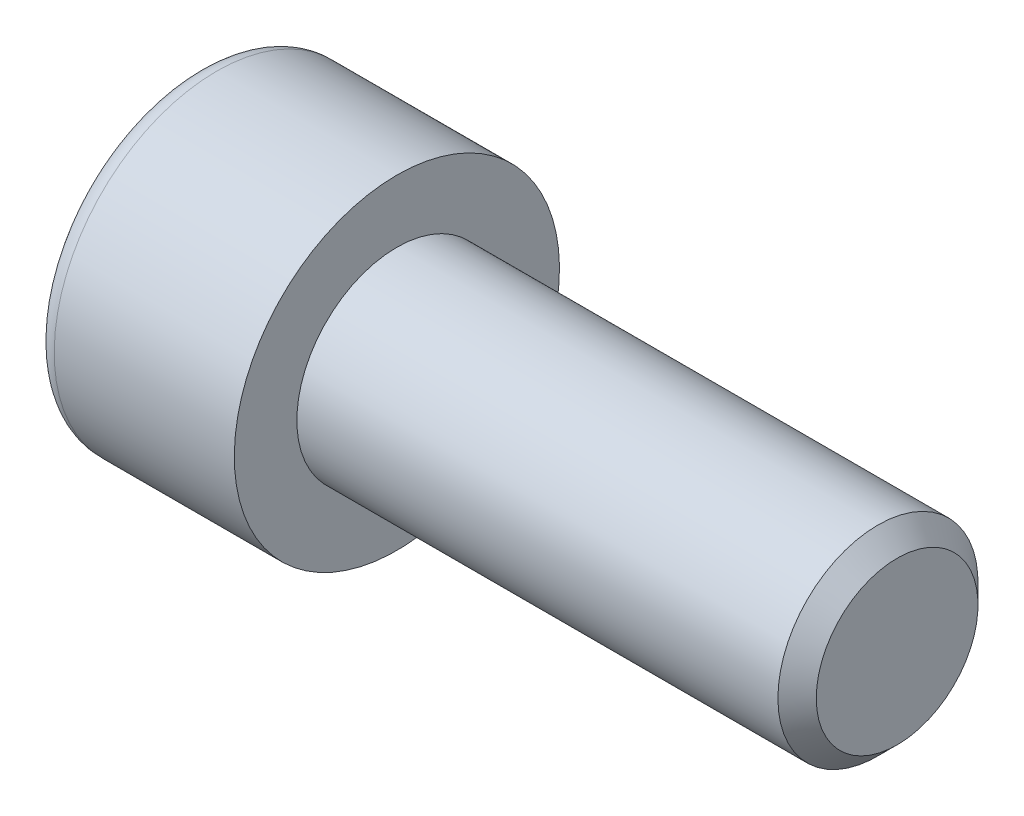
ISO-10303-21;
HEADER;
FILE_DESCRIPTION(('STEP AP214'),'2;1');
FILE_NAME('part.step','',(''),(''),'','','');
FILE_SCHEMA(('AUTOMOTIVE_DESIGN { 1 0 10303 214 1 1 1 1 }'));
ENDSEC;
DATA;
#1=APPLICATION_CONTEXT('core data for automotive mechanical design processes');
#2=APPLICATION_PROTOCOL_DEFINITION('international standard','automotive_design',2000,#1);
#3=PRODUCT_CONTEXT('',#1,'mechanical');
#4=PRODUCT('Part','Part','',(#3));
#5=PRODUCT_RELATED_PRODUCT_CATEGORY('part','',(#4));
#6=PRODUCT_DEFINITION_FORMATION('','',#4);
#7=PRODUCT_DEFINITION_CONTEXT('part definition',#1,'design');
#8=PRODUCT_DEFINITION('design','',#6,#7);
#9=PRODUCT_DEFINITION_SHAPE('','',#8);
#10=(LENGTH_UNIT() NAMED_UNIT(*) SI_UNIT(.MILLI.,.METRE.));
#11=(NAMED_UNIT(*) PLANE_ANGLE_UNIT() SI_UNIT($,.RADIAN.));
#12=(NAMED_UNIT(*) SI_UNIT($,.STERADIAN.) SOLID_ANGLE_UNIT());
#13=UNCERTAINTY_MEASURE_WITH_UNIT(LENGTH_MEASURE(1.E-05),#10,'distance_accuracy_value','');
#14=(GEOMETRIC_REPRESENTATION_CONTEXT(3) GLOBAL_UNCERTAINTY_ASSIGNED_CONTEXT((#13)) GLOBAL_UNIT_ASSIGNED_CONTEXT((#10,
#11,#12)) REPRESENTATION_CONTEXT('',''));
#15=CARTESIAN_POINT('',(0.,0.,0.));
#16=DIRECTION('',(0.,0.,1.));
#17=DIRECTION('',(1.,0.,0.));
#18=AXIS2_PLACEMENT_3D('',#15,#16,#17);
#19=CARTESIAN_POINT('',(-1.99999999995271,0.,0.));
#20=DIRECTION('',(-1.,0.,0.));
#21=DIRECTION('',(0.,0.,1.));
#22=AXIS2_PLACEMENT_3D('',#19,#20,#21);
#23=CONICAL_SURFACE('',#22,0.,1.04719755119726);
#24=CARTESIAN_POINT('',(-1.99999999995271,0.,0.));
#25=VERTEX_POINT('',#24);
#26=VERTEX_LOOP('',#25);
#27=FACE_BOUND('',#26,.T.);
#28=CARTESIAN_POINT('',(-3.99999999995355,1.16431272210433E-11,-3.46410161514448));
#29=CARTESIAN_POINT('',(-3.95604331764328,-0.1318318313331,-3.38798847182983));
#30=CARTESIAN_POINT('',(-3.91606701560335,-0.264801633170532,-3.3112183209449));
#31=CARTESIAN_POINT('',(-3.84628958105283,-0.533043520018228,-3.15634879536545));
#32=CARTESIAN_POINT('',(-3.81651313045926,-0.668320369616218,-3.07824666983492));
#33=CARTESIAN_POINT('',(-3.7701639383706,-0.937197650627964,-2.92301029926381));
#34=CARTESIAN_POINT('',(-3.75328268134649,-1.07075672341447,-2.84589993263781));
#35=CARTESIAN_POINT('',(-3.73313375214613,-1.33850298068321,-2.69131655892919));
#36=CARTESIAN_POINT('',(-3.72984939091142,-1.47268919264835,-2.61384411332958));
#37=CARTESIAN_POINT('',(-3.73669943518174,-1.72340173455697,-2.46909515976942));
#38=CARTESIAN_POINT('',(-3.74515192777386,-1.83996568595987,-2.40179693104915));
#39=CARTESIAN_POINT('',(-3.77193595102684,-2.0723342126447,-2.26763889961647));
#40=CARTESIAN_POINT('',(-3.79027662210282,-2.18813798482582,-2.20077956057452));
#41=CARTESIAN_POINT('',(-3.83612474995801,-2.4209852125897,-2.06634515094499));
#42=CARTESIAN_POINT('',(-3.86382646327845,-2.53799921308,-1.99878708626296));
#43=CARTESIAN_POINT('',(-3.92669764121117,-2.77028245501554,-1.86467829400323));
#44=CARTESIAN_POINT('',(-3.96185234308113,-2.88555466998203,-1.79812584966225));
#45=CARTESIAN_POINT('',(-3.99999999995355,-3.00000000001164,-1.73205080756215));
#46=B_SPLINE_CURVE_WITH_KNOTS('',3,(#28,#29,#30,#31,#32,#33,#34,#35,#36,#37,#38,#39,#40,#41,#42,
#43,#44,#45),.UNSPECIFIED.,.F.,.F.,(4,2,2,2,2,2,2,2,4),(0.,0.475524017336084,0.952190725542287,
1.41706140923175,1.88136133334984,2.28556167395698,2.69013629070679,3.10368243375452,
3.51641696030026),.UNSPECIFIED.);
#47=CARTESIAN_POINT('',(-3.99999999995355,0.,-3.46410161514448));
#48=VERTEX_POINT('',#47);
#49=CARTESIAN_POINT('',(-3.99999999995355,-3.00000000000582,-1.73205080757224));
#50=VERTEX_POINT('',#49);
#51=EDGE_CURVE('E112',#48,#50,#46,.T.);
#52=ORIENTED_EDGE('',*,*,#51,.T.);
#53=CARTESIAN_POINT('',(-3.99999999995355,-3.,-1.73205080758232));
#54=CARTESIAN_POINT('',(-3.95895066106131,-3.,-1.58986661086429));
#55=CARTESIAN_POINT('',(-3.92136883178841,-3.,-1.44655761128608));
#56=CARTESIAN_POINT('',(-3.85494761065179,-3.,-1.15761165691093));
#57=CARTESIAN_POINT('',(-3.82612777945757,-3.,-1.01197024655983));
#58=CARTESIAN_POINT('',(-3.77978200265961,-3.,-0.722321652527097));
#59=CARTESIAN_POINT('',(-3.76200896075295,-3.,-0.57835524906188));
#60=CARTESIAN_POINT('',(-3.73814970600197,-3.,-0.289591848223232));
#61=CARTESIAN_POINT('',(-3.73205080751895,-3.,-0.144795924111616));
#62=CARTESIAN_POINT('',(-3.73205080751895,-3.,0.144795924111616));
#63=CARTESIAN_POINT('',(-3.73814970600197,-3.,0.289591848223232));
#64=CARTESIAN_POINT('',(-3.76200896075295,-3.,0.57835524906188));
#65=CARTESIAN_POINT('',(-3.77978200265961,-3.,0.722321652527096));
#66=CARTESIAN_POINT('',(-3.82612777945757,-3.,1.01197024655983));
#67=CARTESIAN_POINT('',(-3.85494761065179,-3.,1.15761165691093));
#68=CARTESIAN_POINT('',(-3.92136883178841,-3.,1.44655761128608));
#69=CARTESIAN_POINT('',(-3.95895066106131,-3.,1.58986661086429));
#70=CARTESIAN_POINT('',(-3.99999999995355,-3.,1.73205080758232));
#71=B_SPLINE_CURVE_WITH_KNOTS('',3,(#53,#54,#55,#56,#57,#58,#59,#60,#61,#62,#63,#64,#65,#66,#67,
#68,#69,#70),.UNSPECIFIED.,.F.,.F.,(4,2,2,2,2,2,2,2,4),(0.,0.444110093832798,0.88920447903908,
1.32394628866482,1.7582154199005,2.19248455113618,2.62722636076192,3.07232074596821,
3.516430839801),.UNSPECIFIED.);
#72=CARTESIAN_POINT('',(-3.99999999995355,-3.00000000000582,1.73205080757224));
#73=VERTEX_POINT('',#72);
#74=EDGE_CURVE('E107',#50,#73,#71,.T.);
#75=ORIENTED_EDGE('',*,*,#74,.T.);
#76=CARTESIAN_POINT('',(-3.99999999995355,-3.00000000001164,1.73205080756216));
#77=CARTESIAN_POINT('',(-3.95604331764328,-2.8681681686669,1.8081639508768));
#78=CARTESIAN_POINT('',(-3.91606701560335,-2.73519836682947,1.88493410176174));
#79=CARTESIAN_POINT('',(-3.84628958105283,-2.46695647998177,2.03980362734119));
#80=CARTESIAN_POINT('',(-3.81651313045926,-2.33167963038378,2.11790575287171));
#81=CARTESIAN_POINT('',(-3.7701639383706,-2.06280234937204,2.27314212344282));
#82=CARTESIAN_POINT('',(-3.75328268134649,-1.92924327658553,2.35025249006882));
#83=CARTESIAN_POINT('',(-3.73313375214613,-1.6614970193168,2.50483586377744));
#84=CARTESIAN_POINT('',(-3.72984939091142,-1.52731080735165,2.58230830937705));
#85=CARTESIAN_POINT('',(-3.73669943518174,-1.27659826544303,2.72705726293721));
#86=CARTESIAN_POINT('',(-3.74515192777386,-1.16003431404013,2.79435549165748));
#87=CARTESIAN_POINT('',(-3.77193595102684,-0.927665787355303,2.92851352309016));
#88=CARTESIAN_POINT('',(-3.79027662210282,-0.811862015174179,2.99537286213211));
#89=CARTESIAN_POINT('',(-3.83612474995801,-0.5790147874103,3.12980727176164));
#90=CARTESIAN_POINT('',(-3.86382646327845,-0.462000786919997,3.19736533644368));
#91=CARTESIAN_POINT('',(-3.92669764121117,-0.22971754498446,3.3314741287034));
#92=CARTESIAN_POINT('',(-3.96185234308113,-0.114445330017974,3.39802657304438));
#93=CARTESIAN_POINT('',(-3.99999999995355,1.16435634268108E-11,3.46410161514448));
#94=B_SPLINE_CURVE_WITH_KNOTS('',3,(#76,#77,#78,#79,#80,#81,#82,#83,#84,#85,#86,#87,#88,#89,#90,
#91,#92,#93),.UNSPECIFIED.,.F.,.F.,(4,2,2,2,2,2,2,2,4),(0.,0.475524017336084,0.952190725542287,
1.41706140923175,1.88136133334984,2.28556167395698,2.69013629070679,3.10368243375452,
3.51641696030026),.UNSPECIFIED.);
#95=CARTESIAN_POINT('',(-3.99999999995355,0.,3.46410161514448));
#96=VERTEX_POINT('',#95);
#97=EDGE_CURVE('E90',#73,#96,#94,.T.);
#98=ORIENTED_EDGE('',*,*,#97,.T.);
#99=CARTESIAN_POINT('',(-3.99999999995355,-1.1643732701114E-11,3.46410161514448));
#100=CARTESIAN_POINT('',(-3.95604331764328,0.131831831333099,3.38798847182983));
#101=CARTESIAN_POINT('',(-3.91606701560335,0.264801633170531,3.3112183209449));
#102=CARTESIAN_POINT('',(-3.84628958105283,0.533043520018227,3.15634879536545));
#103=CARTESIAN_POINT('',(-3.81651313045926,0.668320369616217,3.07824666983492));
#104=CARTESIAN_POINT('',(-3.7701639383706,0.937197650627964,2.92301029926381));
#105=CARTESIAN_POINT('',(-3.75328268134649,1.07075672341447,2.84589993263781));
#106=CARTESIAN_POINT('',(-3.73313375214612,1.3385029806832,2.69131655892919));
#107=CARTESIAN_POINT('',(-3.72984939091142,1.47268919264835,2.61384411332958));
#108=CARTESIAN_POINT('',(-3.73669943518174,1.72340173455697,2.46909515976942));
#109=CARTESIAN_POINT('',(-3.74515192777386,1.83996568595987,2.40179693104915));
#110=CARTESIAN_POINT('',(-3.77193595102684,2.0723342126447,2.26763889961647));
#111=CARTESIAN_POINT('',(-3.79027662210282,2.18813798482582,2.20077956057452));
#112=CARTESIAN_POINT('',(-3.83612474995801,2.4209852125897,2.06634515094499));
#113=CARTESIAN_POINT('',(-3.86382646327845,2.53799921308,1.99878708626295));
#114=CARTESIAN_POINT('',(-3.92669764121117,2.77028245501554,1.86467829400323));
#115=CARTESIAN_POINT('',(-3.96185234308113,2.88555466998203,1.79812584966225));
#116=CARTESIAN_POINT('',(-3.99999999995355,3.00000000001165,1.73205080756215));
#117=B_SPLINE_CURVE_WITH_KNOTS('',3,(#99,#100,#101,#102,#103,#104,#105,#106,#107,#108,#109,#110,
#111,#112,#113,#114,#115,#116),.UNSPECIFIED.,.F.,.F.,(4,2,2,2,2,2,2,2,4),(0.,0.475524017336083,
0.952190725542287,1.41706140923175,1.88136133334984,2.28556167395698,2.69013629070679,
3.10368243375452,3.51641696030026),.UNSPECIFIED.);
#118=CARTESIAN_POINT('',(-3.99999999995355,3.00000000000582,1.73205080757224));
#119=VERTEX_POINT('',#118);
#120=EDGE_CURVE('E87',#96,#119,#117,.T.);
#121=ORIENTED_EDGE('',*,*,#120,.T.);
#122=CARTESIAN_POINT('',(-3.99999999995355,3.,1.73205080758232));
#123=CARTESIAN_POINT('',(-3.95895066106132,3.,1.58986661086428));
#124=CARTESIAN_POINT('',(-3.92136883178841,3.,1.44655761128608));
#125=CARTESIAN_POINT('',(-3.85494761065179,3.,1.15761165691093));
#126=CARTESIAN_POINT('',(-3.82612777945757,3.,1.01197024655983));
#127=CARTESIAN_POINT('',(-3.77978200265961,3.,0.722321652527095));
#128=CARTESIAN_POINT('',(-3.76200896075295,3.,0.578355249061879));
#129=CARTESIAN_POINT('',(-3.73814970600197,3.,0.289591848223232));
#130=CARTESIAN_POINT('',(-3.73205080751895,3.,0.144795924111616));
#131=CARTESIAN_POINT('',(-3.73205080751895,3.,-0.144795924111617));
#132=CARTESIAN_POINT('',(-3.73814970600197,3.,-0.289591848223233));
#133=CARTESIAN_POINT('',(-3.76200896075295,3.,-0.578355249061881));
#134=CARTESIAN_POINT('',(-3.77978200265961,3.,-0.722321652527099));
#135=CARTESIAN_POINT('',(-3.82612777945757,3.,-1.01197024655983));
#136=CARTESIAN_POINT('',(-3.85494761065179,3.,-1.15761165691094));
#137=CARTESIAN_POINT('',(-3.92136883178841,3.,-1.44655761128608));
#138=CARTESIAN_POINT('',(-3.95895066106132,3.,-1.58986661086429));
#139=CARTESIAN_POINT('',(-3.99999999995355,3.,-1.73205080758233));
#140=B_SPLINE_CURVE_WITH_KNOTS('',3,(#122,#123,#124,#125,#126,#127,#128,#129,#130,#131,#132,
#133,#134,#135,#136,#137,#138,#139),.UNSPECIFIED.,.F.,.F.,(4,2,2,2,2,2,2,2,4),(0.,
0.444110093832797,0.889204479039079,1.32394628866482,1.7582154199005,2.19248455113618,
2.62722636076192,3.07232074596821,3.51643083980101),.UNSPECIFIED.);
#141=CARTESIAN_POINT('',(-3.99999999995161,3.,-1.7320508075756));
#142=VERTEX_POINT('',#141);
#143=EDGE_CURVE('E21',#119,#142,#140,.T.);
#144=ORIENTED_EDGE('',*,*,#143,.T.);
#145=CARTESIAN_POINT('',(-3.99999999995355,3.00000000001164,-1.73205080756216));
#146=CARTESIAN_POINT('',(-3.95604331764328,2.8681681686669,-1.80816395087681));
#147=CARTESIAN_POINT('',(-3.91606701560335,2.73519836682947,-1.88493410176174));
#148=CARTESIAN_POINT('',(-3.84628958105283,2.46695647998177,-2.03980362734119));
#149=CARTESIAN_POINT('',(-3.81651313045926,2.33167963038378,-2.11790575287171));
#150=CARTESIAN_POINT('',(-3.7701639383706,2.06280234937203,-2.27314212344282));
#151=CARTESIAN_POINT('',(-3.75328268134649,1.92924327658553,-2.35025249006883));
#152=CARTESIAN_POINT('',(-3.73313375214613,1.66149701931679,-2.50483586377744));
#153=CARTESIAN_POINT('',(-3.72984939091142,1.52731080735165,-2.58230830937706));
#154=CARTESIAN_POINT('',(-3.73669943518174,1.27659826544302,-2.72705726293722));
#155=CARTESIAN_POINT('',(-3.74515192777386,1.16003431404013,-2.79435549165748));
#156=CARTESIAN_POINT('',(-3.77193595102684,0.927665787355302,-2.92851352309017));
#157=CARTESIAN_POINT('',(-3.79027662210282,0.811862015174178,-2.99537286213211));
#158=CARTESIAN_POINT('',(-3.83612474995801,0.5790147874103,-3.12980727176164));
#159=CARTESIAN_POINT('',(-3.86382646327845,0.462000786919997,-3.19736533644368));
#160=CARTESIAN_POINT('',(-3.92669764121117,0.229717544984461,-3.3314741287034));
#161=CARTESIAN_POINT('',(-3.96185234308113,0.114445330017975,-3.39802657304438));
#162=CARTESIAN_POINT('',(-3.99999999995355,-1.1642871473911E-11,-3.46410161514448));
#163=B_SPLINE_CURVE_WITH_KNOTS('',3,(#145,#146,#147,#148,#149,#150,#151,#152,#153,#154,#155,
#156,#157,#158,#159,#160,#161,#162),.UNSPECIFIED.,.F.,.F.,(4,2,2,2,2,2,2,2,4),(0.,
0.475524017336084,0.952190725542287,1.41706140923175,1.88136133334984,2.28556167395697,
2.69013629070679,3.10368243375452,3.51641696030025),.UNSPECIFIED.);
#164=EDGE_CURVE('E116',#142,#48,#163,.T.);
#165=ORIENTED_EDGE('',*,*,#164,.T.);
#166=EDGE_LOOP('',(#52,#75,#98,#121,#144,#165));
#167=FACE_BOUND('',#166,.T.);
#168=ADVANCED_FACE('F17',(#27,#167),#23,.F.);
#169=CARTESIAN_POINT('',(-8.,3.,1.73205080756887));
#170=DIRECTION('',(0.,1.,0.));
#171=DIRECTION('',(0.,0.,1.));
#172=AXIS2_PLACEMENT_3D('',#169,#170,#171);
#173=PLANE('',#172);
#174=DIRECTION('',(1.,0.,0.));
#175=VECTOR('',#174,1.);
#176=CARTESIAN_POINT('',(-8.,3.,1.73205080756887));
#177=LINE('',#176,#175);
#178=CARTESIAN_POINT('',(-8.,3.,1.73205080756887));
#179=VERTEX_POINT('',#178);
#180=EDGE_CURVE('E79',#119,#179,#177,.F.);
#181=ORIENTED_EDGE('',*,*,#180,.T.);
#182=DIRECTION('',(0.,0.,1.));
#183=VECTOR('',#182,1.);
#184=CARTESIAN_POINT('',(-8.,3.,0.));
#185=LINE('',#184,#183);
#186=CARTESIAN_POINT('',(-8.,3.,-1.73205080756888));
#187=VERTEX_POINT('',#186);
#188=EDGE_CURVE('E159',#187,#179,#185,.T.);
#189=ORIENTED_EDGE('',*,*,#188,.F.);
#190=DIRECTION('',(1.,0.,0.));
#191=VECTOR('',#190,1.);
#192=CARTESIAN_POINT('',(-8.,3.,-1.73205080756888));
#193=LINE('',#192,#191);
#194=EDGE_CURVE('E82',#187,#142,#193,.T.);
#195=ORIENTED_EDGE('',*,*,#194,.T.);
#196=ORIENTED_EDGE('',*,*,#143,.F.);
#197=EDGE_LOOP('',(#181,#189,#195,#196));
#198=FACE_BOUND('',#197,.T.);
#199=ADVANCED_FACE('F76',(#198),#173,.F.);
#200=CARTESIAN_POINT('',(-8.,0.,3.46410161513775));
#201=DIRECTION('',(0.,0.5,0.866025403784438));
#202=DIRECTION('',(0.,-0.866025403784438,0.5));
#203=AXIS2_PLACEMENT_3D('',#200,#201,#202);
#204=PLANE('',#203);
#205=DIRECTION('',(1.,0.,0.));
#206=VECTOR('',#205,1.);
#207=CARTESIAN_POINT('',(-8.,0.,3.46410161513775));
#208=LINE('',#207,#206);
#209=CARTESIAN_POINT('',(-8.,0.,3.46410161513775));
#210=VERTEX_POINT('',#209);
#211=EDGE_CURVE('E93',#96,#210,#208,.F.);
#212=ORIENTED_EDGE('',*,*,#211,.T.);
#213=DIRECTION('',(0.,-0.866025403784438,0.500000000000001));
#214=VECTOR('',#213,1.);
#215=CARTESIAN_POINT('',(-8.,3.,1.73205080756887));
#216=LINE('',#215,#214);
#217=EDGE_CURVE('E96',#179,#210,#216,.T.);
#218=ORIENTED_EDGE('',*,*,#217,.F.);
#219=ORIENTED_EDGE('',*,*,#180,.F.);
#220=ORIENTED_EDGE('',*,*,#120,.F.);
#221=EDGE_LOOP('',(#212,#218,#219,#220));
#222=FACE_BOUND('',#221,.T.);
#223=ADVANCED_FACE('F94',(#222),#204,.F.);
#224=CARTESIAN_POINT('',(-8.,-3.,1.73205080756888));
#225=DIRECTION('',(0.,-0.5,0.866025403784439));
#226=DIRECTION('',(0.,-0.866025403784439,-0.5));
#227=AXIS2_PLACEMENT_3D('',#224,#225,#226);
#228=PLANE('',#227);
#229=DIRECTION('',(1.,0.,0.));
#230=VECTOR('',#229,1.);
#231=CARTESIAN_POINT('',(-8.,-3.,1.73205080756888));
#232=LINE('',#231,#230);
#233=CARTESIAN_POINT('',(-8.,-3.,1.73205080756888));
#234=VERTEX_POINT('',#233);
#235=EDGE_CURVE('E105',#73,#234,#232,.F.);
#236=ORIENTED_EDGE('',*,*,#235,.T.);
#237=DIRECTION('',(0.,-0.866025403784439,-0.5));
#238=VECTOR('',#237,1.);
#239=CARTESIAN_POINT('',(-8.,0.,3.46410161513775));
#240=LINE('',#239,#238);
#241=EDGE_CURVE('E181',#210,#234,#240,.T.);
#242=ORIENTED_EDGE('',*,*,#241,.F.);
#243=ORIENTED_EDGE('',*,*,#211,.F.);
#244=ORIENTED_EDGE('',*,*,#97,.F.);
#245=EDGE_LOOP('',(#236,#242,#243,#244));
#246=FACE_BOUND('',#245,.T.);
#247=ADVANCED_FACE('F230',(#246),#228,.F.);
#248=CARTESIAN_POINT('',(-8.,-3.,-1.73205080756888));
#249=DIRECTION('',(0.,-1.,0.));
#250=DIRECTION('',(0.,0.,-1.));
#251=AXIS2_PLACEMENT_3D('',#248,#249,#250);
#252=PLANE('',#251);
#253=DIRECTION('',(1.,0.,0.));
#254=VECTOR('',#253,1.);
#255=CARTESIAN_POINT('',(-8.,-3.,-1.73205080756888));
#256=LINE('',#255,#254);
#257=CARTESIAN_POINT('',(-8.,-3.,-1.73205080756888));
#258=VERTEX_POINT('',#257);
#259=EDGE_CURVE('E110',#50,#258,#256,.F.);
#260=ORIENTED_EDGE('',*,*,#259,.T.);
#261=DIRECTION('',(0.,0.,1.));
#262=VECTOR('',#261,1.);
#263=CARTESIAN_POINT('',(-8.,-3.,0.));
#264=LINE('',#263,#262);
#265=EDGE_CURVE('E176',#234,#258,#264,.F.);
#266=ORIENTED_EDGE('',*,*,#265,.F.);
#267=ORIENTED_EDGE('',*,*,#235,.F.);
#268=ORIENTED_EDGE('',*,*,#74,.F.);
#269=EDGE_LOOP('',(#260,#266,#267,#268));
#270=FACE_BOUND('',#269,.T.);
#271=ADVANCED_FACE('F233',(#270),#252,.F.);
#272=CARTESIAN_POINT('',(-8.,0.,-3.46410161513776));
#273=DIRECTION('',(0.,-0.5,-0.866025403784438));
#274=DIRECTION('',(0.,0.866025403784438,-0.5));
#275=AXIS2_PLACEMENT_3D('',#272,#273,#274);
#276=PLANE('',#275);
#277=DIRECTION('',(1.,0.,0.));
#278=VECTOR('',#277,1.);
#279=CARTESIAN_POINT('',(-8.,0.,-3.46410161513775));
#280=LINE('',#279,#278);
#281=CARTESIAN_POINT('',(-8.,0.,-3.46410161513776));
#282=VERTEX_POINT('',#281);
#283=EDGE_CURVE('E41',#48,#282,#280,.F.);
#284=ORIENTED_EDGE('',*,*,#283,.T.);
#285=DIRECTION('',(0.,0.866025403784438,-0.5));
#286=VECTOR('',#285,1.);
#287=CARTESIAN_POINT('',(-8.,-3.,-1.73205080756888));
#288=LINE('',#287,#286);
#289=EDGE_CURVE('E171',#258,#282,#288,.T.);
#290=ORIENTED_EDGE('',*,*,#289,.F.);
#291=ORIENTED_EDGE('',*,*,#259,.F.);
#292=ORIENTED_EDGE('',*,*,#51,.F.);
#293=EDGE_LOOP('',(#284,#290,#291,#292));
#294=FACE_BOUND('',#293,.T.);
#295=ADVANCED_FACE('F237',(#294),#276,.F.);
#296=CARTESIAN_POINT('',(-8.,3.,-1.73205080756888));
#297=DIRECTION('',(0.,0.5,-0.866025403784439));
#298=DIRECTION('',(0.,0.866025403784439,0.5));
#299=AXIS2_PLACEMENT_3D('',#296,#297,#298);
#300=PLANE('',#299);
#301=ORIENTED_EDGE('',*,*,#194,.F.);
#302=DIRECTION('',(0.,0.866025403784439,0.5));
#303=VECTOR('',#302,1.);
#304=CARTESIAN_POINT('',(-8.,0.,-3.46410161513776));
#305=LINE('',#304,#303);
#306=EDGE_CURVE('E168',#282,#187,#305,.T.);
#307=ORIENTED_EDGE('',*,*,#306,.F.);
#308=ORIENTED_EDGE('',*,*,#283,.F.);
#309=ORIENTED_EDGE('',*,*,#164,.F.);
#310=EDGE_LOOP('',(#301,#307,#308,#309));
#311=FACE_BOUND('',#310,.T.);
#312=ADVANCED_FACE('F144',(#311),#300,.F.);
#313=CARTESIAN_POINT('',(-8.,4.98205080756888,0.));
#314=DIRECTION('',(-1.,0.,0.));
#315=DIRECTION('',(0.,-1.,0.));
#316=AXIS2_PLACEMENT_3D('',#313,#314,#315);
#317=PLANE('',#316);
#318=CARTESIAN_POINT('',(-7.99999999999999,0.,0.));
#319=DIRECTION('',(1.,0.,0.));
#320=DIRECTION('',(0.,1.,0.));
#321=AXIS2_PLACEMENT_3D('',#318,#319,#320);
#322=CIRCLE('',#321,5.7);
#323=CARTESIAN_POINT('',(-7.99999999999999,5.7,0.));
#324=VERTEX_POINT('',#323);
#325=EDGE_CURVE('E126',#324,#324,#322,.T.);
#326=ORIENTED_EDGE('',*,*,#325,.F.);
#327=EDGE_LOOP('',(#326));
#328=FACE_BOUND('',#327,.T.);
#329=ORIENTED_EDGE('',*,*,#289,.T.);
#330=ORIENTED_EDGE('',*,*,#306,.T.);
#331=ORIENTED_EDGE('',*,*,#188,.T.);
#332=ORIENTED_EDGE('',*,*,#217,.T.);
#333=ORIENTED_EDGE('',*,*,#241,.T.);
#334=ORIENTED_EDGE('',*,*,#265,.T.);
#335=EDGE_LOOP('',(#329,#330,#331,#332,#333,#334));
#336=FACE_BOUND('',#335,.T.);
#337=ADVANCED_FACE('F133',(#328,#336),#317,.T.);
#338=CARTESIAN_POINT('',(-7.2,0.,0.));
#339=DIRECTION('',(1.,0.,0.));
#340=DIRECTION('',(0.,0.,-1.));
#341=AXIS2_PLACEMENT_3D('',#338,#339,#340);
#342=TOROIDAL_SURFACE('',#341,5.7,0.8);
#343=CARTESIAN_POINT('',(-7.2,0.,0.));
#344=DIRECTION('',(1.,0.,0.));
#345=DIRECTION('',(0.,1.,0.));
#346=AXIS2_PLACEMENT_3D('',#343,#344,#345);
#347=CIRCLE('',#346,6.5);
#348=CARTESIAN_POINT('',(-7.2,6.5,0.));
#349=VERTEX_POINT('',#348);
#350=EDGE_CURVE('E197',#349,#349,#347,.T.);
#351=ORIENTED_EDGE('',*,*,#350,.F.);
#352=EDGE_LOOP('',(#351));
#353=FACE_BOUND('',#352,.T.);
#354=ORIENTED_EDGE('',*,*,#325,.T.);
#355=EDGE_LOOP('',(#354));
#356=FACE_BOUND('',#355,.T.);
#357=ADVANCED_FACE('F143',(#353,#356),#342,.T.);
#358=CARTESIAN_POINT('',(20.,2.,0.));
#359=DIRECTION('',(1.,0.,0.));
#360=DIRECTION('',(0.,1.,0.));
#361=AXIS2_PLACEMENT_3D('',#358,#359,#360);
#362=PLANE('',#361);
#363=CARTESIAN_POINT('',(19.9999999999818,0.,0.));
#364=DIRECTION('',(-1.,0.,0.));
#365=DIRECTION('',(0.,0.,1.));
#366=AXIS2_PLACEMENT_3D('',#363,#364,#365);
#367=CIRCLE('',#366,3.23318750002957);
#368=CARTESIAN_POINT('',(19.9999999999818,0.,3.23318750002957));
#369=VERTEX_POINT('',#368);
#370=EDGE_CURVE('E194',#369,#369,#367,.T.);
#371=ORIENTED_EDGE('',*,*,#370,.F.);
#372=EDGE_LOOP('',(#371));
#373=FACE_BOUND('',#372,.T.);
#374=ADVANCED_FACE('F150',(#373),#362,.T.);
#375=CARTESIAN_POINT('',(-4.,0.,0.));
#376=DIRECTION('',(1.,0.,0.));
#377=DIRECTION('',(0.,1.,0.));
#378=AXIS2_PLACEMENT_3D('',#375,#376,#377);
#379=CYLINDRICAL_SURFACE('',#378,6.5);
#380=CARTESIAN_POINT('',(0.,0.,0.));
#381=DIRECTION('',(1.,0.,0.));
#382=DIRECTION('',(0.,1.,0.));
#383=AXIS2_PLACEMENT_3D('',#380,#381,#382);
#384=CIRCLE('',#383,6.5);
#385=CARTESIAN_POINT('',(0.,6.5,0.));
#386=VERTEX_POINT('',#385);
#387=EDGE_CURVE('E191',#386,#386,#384,.T.);
#388=ORIENTED_EDGE('',*,*,#387,.F.);
#389=EDGE_LOOP('',(#388));
#390=FACE_BOUND('',#389,.T.);
#391=ORIENTED_EDGE('',*,*,#350,.T.);
#392=EDGE_LOOP('',(#391));
#393=FACE_BOUND('',#392,.T.);
#394=ADVANCED_FACE('F264',(#390,#393),#379,.T.);
#395=CARTESIAN_POINT('',(19.2331874999923,0.,0.));
#396=DIRECTION('',(-1.,0.,0.));
#397=DIRECTION('',(0.,0.,1.));
#398=AXIS2_PLACEMENT_3D('',#395,#396,#397);
#399=CONICAL_SURFACE('',#398,4.0000000000191,0.785398163397448);
#400=CARTESIAN_POINT('',(19.2331875,0.,0.));
#401=DIRECTION('',(1.,0.,0.));
#402=DIRECTION('',(0.,1.,0.));
#403=AXIS2_PLACEMENT_3D('',#400,#401,#402);
#404=CIRCLE('',#403,4.);
#405=CARTESIAN_POINT('',(19.2331875,4.,0.));
#406=VERTEX_POINT('',#405);
#407=EDGE_CURVE('E32',#406,#406,#404,.F.);
#408=ORIENTED_EDGE('',*,*,#407,.F.);
#409=EDGE_LOOP('',(#408));
#410=FACE_BOUND('',#409,.T.);
#411=ORIENTED_EDGE('',*,*,#370,.T.);
#412=EDGE_LOOP('',(#411));
#413=FACE_BOUND('',#412,.T.);
#414=ADVANCED_FACE('F252',(#410,#413),#399,.T.);
#415=CARTESIAN_POINT('',(0.,5.25,0.));
#416=DIRECTION('',(1.,0.,0.));
#417=DIRECTION('',(0.,1.,0.));
#418=AXIS2_PLACEMENT_3D('',#415,#416,#417);
#419=PLANE('',#418);
#420=ORIENTED_EDGE('',*,*,#387,.T.);
#421=EDGE_LOOP('',(#420));
#422=FACE_BOUND('',#421,.T.);
#423=CARTESIAN_POINT('',(0.,0.,0.));
#424=DIRECTION('',(1.,0.,0.));
#425=DIRECTION('',(0.,1.,0.));
#426=AXIS2_PLACEMENT_3D('',#423,#424,#425);
#427=CIRCLE('',#426,4.);
#428=CARTESIAN_POINT('',(0.,4.,0.));
#429=VERTEX_POINT('',#428);
#430=EDGE_CURVE('E11',#429,#429,#427,.T.);
#431=ORIENTED_EDGE('',*,*,#430,.F.);
#432=EDGE_LOOP('',(#431));
#433=FACE_BOUND('',#432,.T.);
#434=ADVANCED_FACE('F247',(#422,#433),#419,.T.);
#435=CARTESIAN_POINT('',(11.5625,0.,0.));
#436=DIRECTION('',(1.,0.,0.));
#437=DIRECTION('',(0.,1.,0.));
#438=AXIS2_PLACEMENT_3D('',#435,#436,#437);
#439=CYLINDRICAL_SURFACE('',#438,4.);
#440=ORIENTED_EDGE('',*,*,#407,.T.);
#441=EDGE_LOOP('',(#440));
#442=FACE_BOUND('',#441,.T.);
#443=ORIENTED_EDGE('',*,*,#430,.T.);
#444=EDGE_LOOP('',(#443));
#445=FACE_BOUND('',#444,.T.);
#446=ADVANCED_FACE('F19',(#442,#445),#439,.T.);
#447=CLOSED_SHELL('',(#168,#199,#223,#247,#271,#295,#312,#337,#357,#374,#394,#414,#434,#446));
#448=MANIFOLD_SOLID_BREP('B1',#447);
#449=ADVANCED_BREP_SHAPE_REPRESENTATION('',(#18,#448),#14);
#450=SHAPE_DEFINITION_REPRESENTATION(#9,#449);
ENDSEC;
END-ISO-10303-21;
